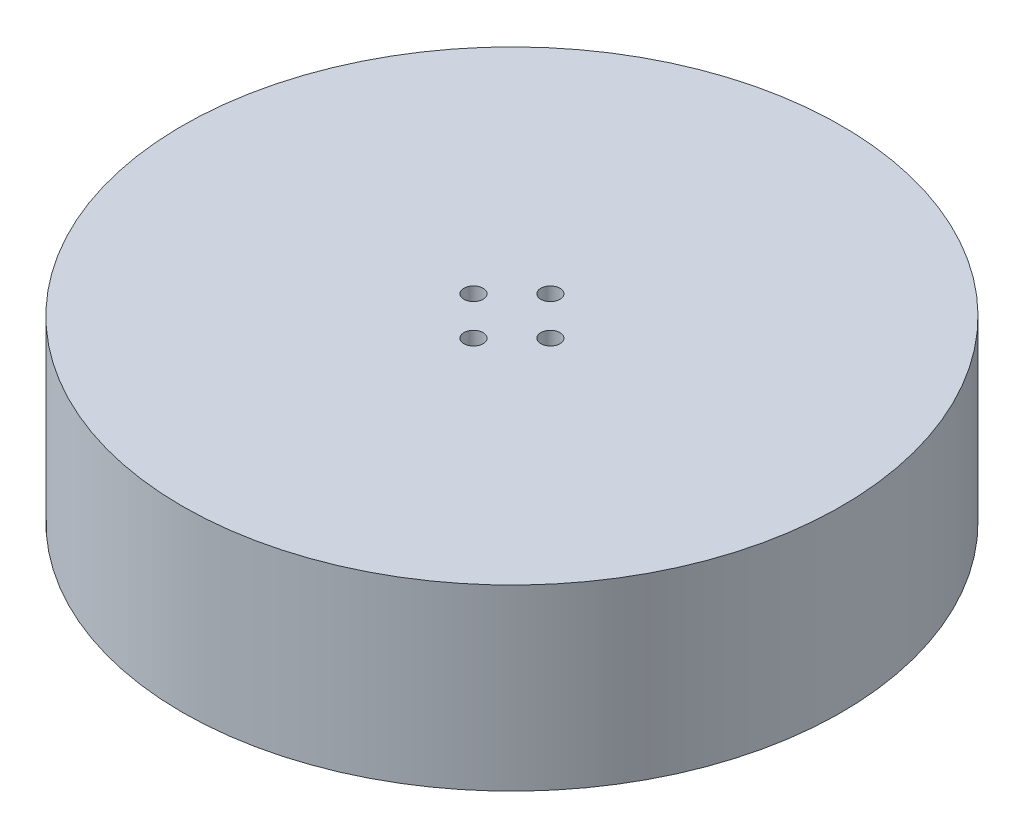
ISO-10303-21;
HEADER;
FILE_DESCRIPTION(('STEP AP214'),'2;1');
FILE_NAME('part.step','',(''),(''),'','','');
FILE_SCHEMA(('AUTOMOTIVE_DESIGN { 1 0 10303 214 1 1 1 1 }'));
ENDSEC;
DATA;
#1=APPLICATION_CONTEXT('core data for automotive mechanical design processes');
#2=APPLICATION_PROTOCOL_DEFINITION('international standard','automotive_design',2000,#1);
#3=PRODUCT_CONTEXT('',#1,'mechanical');
#4=PRODUCT('Part','Part','',(#3));
#5=PRODUCT_RELATED_PRODUCT_CATEGORY('part','',(#4));
#6=PRODUCT_DEFINITION_FORMATION('','',#4);
#7=PRODUCT_DEFINITION_CONTEXT('part definition',#1,'design');
#8=PRODUCT_DEFINITION('design','',#6,#7);
#9=PRODUCT_DEFINITION_SHAPE('','',#8);
#10=(LENGTH_UNIT() NAMED_UNIT(*) SI_UNIT(.MILLI.,.METRE.));
#11=(NAMED_UNIT(*) PLANE_ANGLE_UNIT() SI_UNIT($,.RADIAN.));
#12=(NAMED_UNIT(*) SI_UNIT($,.STERADIAN.) SOLID_ANGLE_UNIT());
#13=UNCERTAINTY_MEASURE_WITH_UNIT(LENGTH_MEASURE(1.E-05),#10,'distance_accuracy_value','');
#14=(GEOMETRIC_REPRESENTATION_CONTEXT(3) GLOBAL_UNCERTAINTY_ASSIGNED_CONTEXT((#13)) GLOBAL_UNIT_ASSIGNED_CONTEXT((#10,
#11,#12)) REPRESENTATION_CONTEXT('',''));
#15=CARTESIAN_POINT('',(0.,0.,0.));
#16=DIRECTION('',(0.,0.,1.));
#17=DIRECTION('',(1.,0.,0.));
#18=AXIS2_PLACEMENT_3D('',#15,#16,#17);
#19=CARTESIAN_POINT('',(0.,32.5,0.));
#20=DIRECTION('',(0.,-1.,0.));
#21=DIRECTION('',(0.,0.,-1.));
#22=AXIS2_PLACEMENT_3D('',#19,#20,#21);
#23=CYLINDRICAL_SURFACE('',#22,60.);
#24=CARTESIAN_POINT('',(0.,32.5,0.));
#25=DIRECTION('',(0.,1.,0.));
#26=DIRECTION('',(0.,0.,1.));
#27=AXIS2_PLACEMENT_3D('',#24,#25,#26);
#28=CIRCLE('',#27,60.);
#29=CARTESIAN_POINT('',(0.,32.5,60.));
#30=VERTEX_POINT('',#29);
#31=EDGE_CURVE('E10',#30,#30,#28,.T.);
#32=ORIENTED_EDGE('',*,*,#31,.F.);
#33=EDGE_LOOP('',(#32));
#34=FACE_BOUND('',#33,.T.);
#35=CARTESIAN_POINT('',(0.,0.,0.));
#36=DIRECTION('',(0.,1.,0.));
#37=DIRECTION('',(0.,0.,1.));
#38=AXIS2_PLACEMENT_3D('',#35,#36,#37);
#39=CIRCLE('',#38,60.);
#40=CARTESIAN_POINT('',(0.,0.,60.));
#41=VERTEX_POINT('',#40);
#42=EDGE_CURVE('E37',#41,#41,#39,.T.);
#43=ORIENTED_EDGE('',*,*,#42,.T.);
#44=EDGE_LOOP('',(#43));
#45=FACE_BOUND('',#44,.T.);
#46=ADVANCED_FACE('F34',(#34,#45),#23,.T.);
#47=CARTESIAN_POINT('',(0.,32.5,0.));
#48=DIRECTION('',(0.,1.,0.));
#49=DIRECTION('',(0.,0.,1.));
#50=AXIS2_PLACEMENT_3D('',#47,#48,#49);
#51=PLANE('',#50);
#52=CARTESIAN_POINT('',(7.,32.5,0.));
#53=DIRECTION('',(0.,1.,0.));
#54=DIRECTION('',(0.,0.,1.));
#55=AXIS2_PLACEMENT_3D('',#52,#53,#54);
#56=CIRCLE('',#55,1.75);
#57=CARTESIAN_POINT('',(7.,32.5,1.75));
#58=VERTEX_POINT('',#57);
#59=EDGE_CURVE('E64',#58,#58,#56,.T.);
#60=ORIENTED_EDGE('',*,*,#59,.F.);
#61=EDGE_LOOP('',(#60));
#62=FACE_BOUND('',#61,.T.);
#63=CARTESIAN_POINT('',(0.,32.5,7.));
#64=DIRECTION('',(0.,1.,0.));
#65=DIRECTION('',(0.,0.,1.));
#66=AXIS2_PLACEMENT_3D('',#63,#64,#65);
#67=CIRCLE('',#66,1.75);
#68=CARTESIAN_POINT('',(0.,32.5,8.75));
#69=VERTEX_POINT('',#68);
#70=EDGE_CURVE('E58',#69,#69,#67,.T.);
#71=ORIENTED_EDGE('',*,*,#70,.F.);
#72=EDGE_LOOP('',(#71));
#73=FACE_BOUND('',#72,.T.);
#74=CARTESIAN_POINT('',(-7.,32.5,0.));
#75=DIRECTION('',(0.,1.,0.));
#76=DIRECTION('',(0.,0.,1.));
#77=AXIS2_PLACEMENT_3D('',#74,#75,#76);
#78=CIRCLE('',#77,1.75);
#79=CARTESIAN_POINT('',(-7.,32.5,1.75));
#80=VERTEX_POINT('',#79);
#81=EDGE_CURVE('E52',#80,#80,#78,.T.);
#82=ORIENTED_EDGE('',*,*,#81,.F.);
#83=EDGE_LOOP('',(#82));
#84=FACE_BOUND('',#83,.T.);
#85=CARTESIAN_POINT('',(0.,32.5,-7.));
#86=DIRECTION('',(0.,1.,0.));
#87=DIRECTION('',(0.,0.,1.));
#88=AXIS2_PLACEMENT_3D('',#85,#86,#87);
#89=CIRCLE('',#88,1.75);
#90=CARTESIAN_POINT('',(0.,32.5,-5.25));
#91=VERTEX_POINT('',#90);
#92=EDGE_CURVE('E46',#91,#91,#89,.T.);
#93=ORIENTED_EDGE('',*,*,#92,.F.);
#94=EDGE_LOOP('',(#93));
#95=FACE_BOUND('',#94,.T.);
#96=ORIENTED_EDGE('',*,*,#31,.T.);
#97=EDGE_LOOP('',(#96));
#98=FACE_BOUND('',#97,.T.);
#99=ADVANCED_FACE('F79',(#62,#73,#84,#95,#98),#51,.T.);
#100=CARTESIAN_POINT('',(0.,0.,0.));
#101=DIRECTION('',(0.,1.,0.));
#102=DIRECTION('',(0.,0.,1.));
#103=AXIS2_PLACEMENT_3D('',#100,#101,#102);
#104=PLANE('',#103);
#105=ORIENTED_EDGE('',*,*,#42,.F.);
#106=EDGE_LOOP('',(#105));
#107=FACE_BOUND('',#106,.T.);
#108=ADVANCED_FACE('F82',(#107),#104,.F.);
#109=CARTESIAN_POINT('',(0.,22.5,-7.));
#110=DIRECTION('',(0.,1.,0.));
#111=DIRECTION('',(0.,0.,1.));
#112=AXIS2_PLACEMENT_3D('',#109,#110,#111);
#113=CYLINDRICAL_SURFACE('',#112,1.75);
#114=CARTESIAN_POINT('',(0.,22.5,-7.));
#115=DIRECTION('',(0.,1.,0.));
#116=DIRECTION('',(0.,0.,1.));
#117=AXIS2_PLACEMENT_3D('',#114,#115,#116);
#118=CIRCLE('',#117,1.75);
#119=CARTESIAN_POINT('',(0.,22.5,-5.25));
#120=VERTEX_POINT('',#119);
#121=EDGE_CURVE('E49',#120,#120,#118,.T.);
#122=ORIENTED_EDGE('',*,*,#121,.F.);
#123=EDGE_LOOP('',(#122));
#124=FACE_BOUND('',#123,.T.);
#125=ORIENTED_EDGE('',*,*,#92,.T.);
#126=EDGE_LOOP('',(#125));
#127=FACE_BOUND('',#126,.T.);
#128=ADVANCED_FACE('F90',(#124,#127),#113,.F.);
#129=CARTESIAN_POINT('',(0.,22.5,-7.));
#130=DIRECTION('',(0.,1.,0.));
#131=DIRECTION('',(0.,0.,1.));
#132=AXIS2_PLACEMENT_3D('',#129,#130,#131);
#133=PLANE('',#132);
#134=ORIENTED_EDGE('',*,*,#121,.T.);
#135=EDGE_LOOP('',(#134));
#136=FACE_BOUND('',#135,.T.);
#137=ADVANCED_FACE('F92',(#136),#133,.T.);
#138=CARTESIAN_POINT('',(-7.,22.5,0.));
#139=DIRECTION('',(0.,1.,0.));
#140=DIRECTION('',(0.,0.,1.));
#141=AXIS2_PLACEMENT_3D('',#138,#139,#140);
#142=CYLINDRICAL_SURFACE('',#141,1.75);
#143=CARTESIAN_POINT('',(-7.,22.5,0.));
#144=DIRECTION('',(0.,1.,0.));
#145=DIRECTION('',(0.,0.,1.));
#146=AXIS2_PLACEMENT_3D('',#143,#144,#145);
#147=CIRCLE('',#146,1.75);
#148=CARTESIAN_POINT('',(-7.,22.5,1.75));
#149=VERTEX_POINT('',#148);
#150=EDGE_CURVE('E55',#149,#149,#147,.T.);
#151=ORIENTED_EDGE('',*,*,#150,.F.);
#152=EDGE_LOOP('',(#151));
#153=FACE_BOUND('',#152,.T.);
#154=ORIENTED_EDGE('',*,*,#81,.T.);
#155=EDGE_LOOP('',(#154));
#156=FACE_BOUND('',#155,.T.);
#157=ADVANCED_FACE('F99',(#153,#156),#142,.F.);
#158=CARTESIAN_POINT('',(-7.,22.5,0.));
#159=DIRECTION('',(0.,1.,0.));
#160=DIRECTION('',(0.,0.,1.));
#161=AXIS2_PLACEMENT_3D('',#158,#159,#160);
#162=PLANE('',#161);
#163=ORIENTED_EDGE('',*,*,#150,.T.);
#164=EDGE_LOOP('',(#163));
#165=FACE_BOUND('',#164,.T.);
#166=ADVANCED_FACE('F139',(#165),#162,.T.);
#167=CARTESIAN_POINT('',(0.,22.5,7.));
#168=DIRECTION('',(0.,1.,0.));
#169=DIRECTION('',(0.,0.,1.));
#170=AXIS2_PLACEMENT_3D('',#167,#168,#169);
#171=CYLINDRICAL_SURFACE('',#170,1.75);
#172=CARTESIAN_POINT('',(0.,22.5,7.));
#173=DIRECTION('',(0.,1.,0.));
#174=DIRECTION('',(0.,0.,1.));
#175=AXIS2_PLACEMENT_3D('',#172,#173,#174);
#176=CIRCLE('',#175,1.75);
#177=CARTESIAN_POINT('',(0.,22.5,8.75));
#178=VERTEX_POINT('',#177);
#179=EDGE_CURVE('E61',#178,#178,#176,.T.);
#180=ORIENTED_EDGE('',*,*,#179,.F.);
#181=EDGE_LOOP('',(#180));
#182=FACE_BOUND('',#181,.T.);
#183=ORIENTED_EDGE('',*,*,#70,.T.);
#184=EDGE_LOOP('',(#183));
#185=FACE_BOUND('',#184,.T.);
#186=ADVANCED_FACE('F148',(#182,#185),#171,.F.);
#187=CARTESIAN_POINT('',(0.,22.5,7.));
#188=DIRECTION('',(0.,1.,0.));
#189=DIRECTION('',(0.,0.,1.));
#190=AXIS2_PLACEMENT_3D('',#187,#188,#189);
#191=PLANE('',#190);
#192=ORIENTED_EDGE('',*,*,#179,.T.);
#193=EDGE_LOOP('',(#192));
#194=FACE_BOUND('',#193,.T.);
#195=ADVANCED_FACE('F75',(#194),#191,.T.);
#196=CARTESIAN_POINT('',(7.,22.5,0.));
#197=DIRECTION('',(0.,1.,0.));
#198=DIRECTION('',(0.,0.,1.));
#199=AXIS2_PLACEMENT_3D('',#196,#197,#198);
#200=CYLINDRICAL_SURFACE('',#199,1.75);
#201=CARTESIAN_POINT('',(7.,22.5,0.));
#202=DIRECTION('',(0.,1.,0.));
#203=DIRECTION('',(0.,0.,1.));
#204=AXIS2_PLACEMENT_3D('',#201,#202,#203);
#205=CIRCLE('',#204,1.75);
#206=CARTESIAN_POINT('',(7.,22.5,1.75));
#207=VERTEX_POINT('',#206);
#208=EDGE_CURVE('E44',#207,#207,#205,.T.);
#209=ORIENTED_EDGE('',*,*,#208,.F.);
#210=EDGE_LOOP('',(#209));
#211=FACE_BOUND('',#210,.T.);
#212=ORIENTED_EDGE('',*,*,#59,.T.);
#213=EDGE_LOOP('',(#212));
#214=FACE_BOUND('',#213,.T.);
#215=ADVANCED_FACE('F72',(#211,#214),#200,.F.);
#216=CARTESIAN_POINT('',(7.,22.5,0.));
#217=DIRECTION('',(0.,1.,0.));
#218=DIRECTION('',(0.,0.,1.));
#219=AXIS2_PLACEMENT_3D('',#216,#217,#218);
#220=PLANE('',#219);
#221=ORIENTED_EDGE('',*,*,#208,.T.);
#222=EDGE_LOOP('',(#221));
#223=FACE_BOUND('',#222,.T.);
#224=ADVANCED_FACE('F70',(#223),#220,.T.);
#225=CLOSED_SHELL('',(#46,#99,#108,#128,#137,#157,#166,#186,#195,#215,#224));
#226=MANIFOLD_SOLID_BREP('B2',#225);
#227=ADVANCED_BREP_SHAPE_REPRESENTATION('',(#18,#226),#14);
#228=SHAPE_DEFINITION_REPRESENTATION(#9,#227);
ENDSEC;
END-ISO-10303-21;
